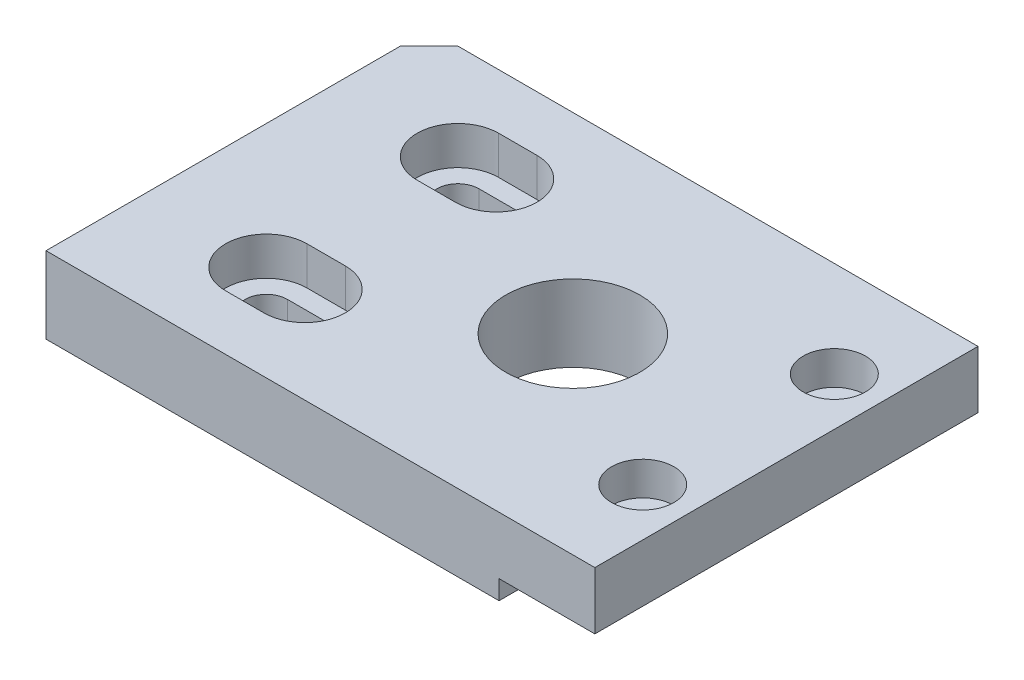
ISO-10303-21;
HEADER;
FILE_DESCRIPTION(('STEP AP214'),'2;1');
FILE_NAME('part.step','',(''),(''),'','','');
FILE_SCHEMA(('AUTOMOTIVE_DESIGN { 1 0 10303 214 1 1 1 1 }'));
ENDSEC;
DATA;
#1=APPLICATION_CONTEXT('core data for automotive mechanical design processes');
#2=APPLICATION_PROTOCOL_DEFINITION('international standard','automotive_design',2000,#1);
#3=PRODUCT_CONTEXT('',#1,'mechanical');
#4=PRODUCT('Part','Part','',(#3));
#5=PRODUCT_RELATED_PRODUCT_CATEGORY('part','',(#4));
#6=PRODUCT_DEFINITION_FORMATION('','',#4);
#7=PRODUCT_DEFINITION_CONTEXT('part definition',#1,'design');
#8=PRODUCT_DEFINITION('design','',#6,#7);
#9=PRODUCT_DEFINITION_SHAPE('','',#8);
#10=(LENGTH_UNIT() NAMED_UNIT(*) SI_UNIT(.MILLI.,.METRE.));
#11=(NAMED_UNIT(*) PLANE_ANGLE_UNIT() SI_UNIT($,.RADIAN.));
#12=(NAMED_UNIT(*) SI_UNIT($,.STERADIAN.) SOLID_ANGLE_UNIT());
#13=UNCERTAINTY_MEASURE_WITH_UNIT(LENGTH_MEASURE(1.E-05),#10,'distance_accuracy_value','');
#14=(GEOMETRIC_REPRESENTATION_CONTEXT(3) GLOBAL_UNCERTAINTY_ASSIGNED_CONTEXT((#13)) GLOBAL_UNIT_ASSIGNED_CONTEXT((#10,
#11,#12)) REPRESENTATION_CONTEXT('',''));
#15=CARTESIAN_POINT('',(0.,0.,0.));
#16=DIRECTION('',(0.,0.,1.));
#17=DIRECTION('',(1.,0.,0.));
#18=AXIS2_PLACEMENT_3D('',#15,#16,#17);
#19=CARTESIAN_POINT('',(17.0000000009921,4.,34.25));
#20=DIRECTION('',(0.,0.,-1.));
#21=DIRECTION('',(0.,-1.,0.));
#22=AXIS2_PLACEMENT_3D('',#19,#20,#21);
#23=PLANE('',#22);
#24=DIRECTION('',(-1.,0.,0.));
#25=VECTOR('',#24,1.);
#26=CARTESIAN_POINT('',(17.0000000009921,8.,34.25));
#27=LINE('',#26,#25);
#28=CARTESIAN_POINT('',(17.0000000010029,8.,34.25));
#29=VERTEX_POINT('',#28);
#30=CARTESIAN_POINT('',(13.0000000009816,8.,34.25));
#31=VERTEX_POINT('',#30);
#32=EDGE_CURVE('E283',#29,#31,#27,.T.);
#33=ORIENTED_EDGE('',*,*,#32,.F.);
#34=DIRECTION('',(0.,-1.,0.));
#35=VECTOR('',#34,1.);
#36=CARTESIAN_POINT('',(17.0000000010029,4.,34.25));
#37=LINE('',#36,#35);
#38=CARTESIAN_POINT('',(17.0000000010029,4.,34.25));
#39=VERTEX_POINT('',#38);
#40=EDGE_CURVE('E11',#29,#39,#37,.T.);
#41=ORIENTED_EDGE('',*,*,#40,.T.);
#42=DIRECTION('',(1.,0.,0.));
#43=VECTOR('',#42,1.);
#44=CARTESIAN_POINT('',(17.0000000009921,4.,34.25));
#45=LINE('',#44,#43);
#46=CARTESIAN_POINT('',(13.0000000009816,4.,34.25));
#47=VERTEX_POINT('',#46);
#48=EDGE_CURVE('E352',#47,#39,#45,.T.);
#49=ORIENTED_EDGE('',*,*,#48,.F.);
#50=DIRECTION('',(0.,-1.,0.));
#51=VECTOR('',#50,1.);
#52=CARTESIAN_POINT('',(13.0000000009816,4.,34.25));
#53=LINE('',#52,#51);
#54=EDGE_CURVE('E366',#31,#47,#53,.T.);
#55=ORIENTED_EDGE('',*,*,#54,.F.);
#56=EDGE_LOOP('',(#33,#41,#49,#55));
#57=FACE_BOUND('',#56,.T.);
#58=ADVANCED_FACE('F16',(#57),#23,.T.);
#59=CARTESIAN_POINT('',(17.0000000009921,4.,30.));
#60=DIRECTION('',(0.,1.,0.));
#61=DIRECTION('',(0.,0.,1.));
#62=AXIS2_PLACEMENT_3D('',#59,#60,#61);
#63=CYLINDRICAL_SURFACE('',#62,4.25);
#64=CARTESIAN_POINT('',(17.0000000009921,8.,30.));
#65=DIRECTION('',(0.,-1.,0.));
#66=DIRECTION('',(-1.,0.,0.));
#67=AXIS2_PLACEMENT_3D('',#64,#65,#66);
#68=CIRCLE('',#67,4.25);
#69=CARTESIAN_POINT('',(17.0000000009921,8.,25.75));
#70=VERTEX_POINT('',#69);
#71=EDGE_CURVE('E416',#70,#29,#68,.T.);
#72=ORIENTED_EDGE('',*,*,#71,.F.);
#73=DIRECTION('',(0.,-1.,0.));
#74=VECTOR('',#73,1.);
#75=CARTESIAN_POINT('',(17.0000000009921,4.,25.75));
#76=LINE('',#75,#74);
#77=CARTESIAN_POINT('',(17.0000000009921,4.,25.75));
#78=VERTEX_POINT('',#77);
#79=EDGE_CURVE('E27',#70,#78,#76,.T.);
#80=ORIENTED_EDGE('',*,*,#79,.T.);
#81=CARTESIAN_POINT('',(17.0000000009921,4.,30.));
#82=DIRECTION('',(0.,1.,0.));
#83=DIRECTION('',(-1.,0.,0.));
#84=AXIS2_PLACEMENT_3D('',#81,#82,#83);
#85=CIRCLE('',#84,4.25);
#86=EDGE_CURVE('E356',#39,#78,#85,.T.);
#87=ORIENTED_EDGE('',*,*,#86,.F.);
#88=ORIENTED_EDGE('',*,*,#40,.F.);
#89=EDGE_LOOP('',(#72,#80,#87,#88));
#90=FACE_BOUND('',#89,.T.);
#91=ADVANCED_FACE('F563',(#90),#63,.F.);
#92=CARTESIAN_POINT('',(13.0000000009924,4.,25.75));
#93=DIRECTION('',(0.,0.,1.));
#94=DIRECTION('',(1.,0.,0.));
#95=AXIS2_PLACEMENT_3D('',#92,#93,#94);
#96=PLANE('',#95);
#97=DIRECTION('',(1.,0.,0.));
#98=VECTOR('',#97,1.);
#99=CARTESIAN_POINT('',(13.0000000009924,8.,25.75));
#100=LINE('',#99,#98);
#101=CARTESIAN_POINT('',(13.0000000009834,8.,25.75));
#102=VERTEX_POINT('',#101);
#103=EDGE_CURVE('E420',#102,#70,#100,.T.);
#104=ORIENTED_EDGE('',*,*,#103,.F.);
#105=DIRECTION('',(0.,-1.,0.));
#106=VECTOR('',#105,1.);
#107=CARTESIAN_POINT('',(13.0000000009834,4.,25.75));
#108=LINE('',#107,#106);
#109=CARTESIAN_POINT('',(13.0000000009834,4.,25.75));
#110=VERTEX_POINT('',#109);
#111=EDGE_CURVE('E371',#102,#110,#108,.T.);
#112=ORIENTED_EDGE('',*,*,#111,.T.);
#113=DIRECTION('',(-1.,0.,0.));
#114=VECTOR('',#113,1.);
#115=CARTESIAN_POINT('',(13.0000000009924,4.,25.75));
#116=LINE('',#115,#114);
#117=EDGE_CURVE('E362',#78,#110,#116,.T.);
#118=ORIENTED_EDGE('',*,*,#117,.F.);
#119=ORIENTED_EDGE('',*,*,#79,.F.);
#120=EDGE_LOOP('',(#104,#112,#118,#119));
#121=FACE_BOUND('',#120,.T.);
#122=ADVANCED_FACE('F553',(#121),#96,.T.);
#123=CARTESIAN_POINT('',(13.0000000009924,4.,30.));
#124=DIRECTION('',(0.,1.,0.));
#125=DIRECTION('',(0.,0.,1.));
#126=AXIS2_PLACEMENT_3D('',#123,#124,#125);
#127=CYLINDRICAL_SURFACE('',#126,4.25);
#128=CARTESIAN_POINT('',(13.0000000009924,8.,30.));
#129=DIRECTION('',(0.,-1.,0.));
#130=DIRECTION('',(-1.,0.,0.));
#131=AXIS2_PLACEMENT_3D('',#128,#129,#130);
#132=CIRCLE('',#131,4.25);
#133=EDGE_CURVE('E287',#31,#102,#132,.T.);
#134=ORIENTED_EDGE('',*,*,#133,.F.);
#135=ORIENTED_EDGE('',*,*,#54,.T.);
#136=CARTESIAN_POINT('',(13.0000000009924,4.,30.));
#137=DIRECTION('',(0.,1.,0.));
#138=DIRECTION('',(-1.,0.,0.));
#139=AXIS2_PLACEMENT_3D('',#136,#137,#138);
#140=CIRCLE('',#139,4.25);
#141=EDGE_CURVE('E253',#110,#47,#140,.T.);
#142=ORIENTED_EDGE('',*,*,#141,.F.);
#143=ORIENTED_EDGE('',*,*,#111,.F.);
#144=EDGE_LOOP('',(#134,#135,#142,#143));
#145=FACE_BOUND('',#144,.T.);
#146=ADVANCED_FACE('F559',(#145),#127,.F.);
#147=CARTESIAN_POINT('',(13.0000000009924,4.,30.));
#148=DIRECTION('',(0.,-1.,0.));
#149=DIRECTION('',(0.,0.,-1.));
#150=AXIS2_PLACEMENT_3D('',#147,#148,#149);
#151=PLANE('',#150);
#152=DIRECTION('',(-1.,0.,5.68928584798764E-11));
#153=VECTOR('',#152,1.);
#154=CARTESIAN_POINT('',(17.000000000867,4.,27.8));
#155=LINE('',#154,#153);
#156=CARTESIAN_POINT('',(17.0000000009921,4.,27.8));
#157=VERTEX_POINT('',#156);
#158=CARTESIAN_POINT('',(13.0000000008672,4.,27.8000000002276));
#159=VERTEX_POINT('',#158);
#160=EDGE_CURVE('E314',#157,#159,#155,.T.);
#161=ORIENTED_EDGE('',*,*,#160,.F.);
#162=CARTESIAN_POINT('',(17.0000000009921,4.,30.));
#163=DIRECTION('',(0.,1.,0.));
#164=DIRECTION('',(0.,0.,-1.));
#165=AXIS2_PLACEMENT_3D('',#162,#163,#164);
#166=CIRCLE('',#165,2.2);
#167=CARTESIAN_POINT('',(17.0000000009296,4.,32.2));
#168=VERTEX_POINT('',#167);
#169=EDGE_CURVE('E370',#168,#157,#166,.T.);
#170=ORIENTED_EDGE('',*,*,#169,.F.);
#171=DIRECTION('',(1.,0.,5.68937258416144E-11));
#172=VECTOR('',#171,1.);
#173=CARTESIAN_POINT('',(13.0000000008672,4.,32.1999999997724));
#174=LINE('',#173,#172);
#175=CARTESIAN_POINT('',(13.0000000009924,4.,32.1999999997724));
#176=VERTEX_POINT('',#175);
#177=EDGE_CURVE('E291',#176,#168,#174,.T.);
#178=ORIENTED_EDGE('',*,*,#177,.F.);
#179=CARTESIAN_POINT('',(13.0000000009924,4.,30.));
#180=DIRECTION('',(0.,1.,0.));
#181=DIRECTION('',(0.,0.,-1.));
#182=AXIS2_PLACEMENT_3D('',#179,#180,#181);
#183=CIRCLE('',#182,2.19999999977243);
#184=EDGE_CURVE('E292',#159,#176,#183,.T.);
#185=ORIENTED_EDGE('',*,*,#184,.F.);
#186=EDGE_LOOP('',(#161,#170,#178,#185));
#187=FACE_BOUND('',#186,.T.);
#188=ORIENTED_EDGE('',*,*,#141,.T.);
#189=ORIENTED_EDGE('',*,*,#48,.T.);
#190=ORIENTED_EDGE('',*,*,#86,.T.);
#191=ORIENTED_EDGE('',*,*,#117,.T.);
#192=EDGE_LOOP('',(#188,#189,#190,#191));
#193=FACE_BOUND('',#192,.T.);
#194=ADVANCED_FACE('F558',(#187,#193),#151,.F.);
#195=CARTESIAN_POINT('',(12.9999999999912,4.,9.99999999989814));
#196=DIRECTION('',(0.,1.,0.));
#197=DIRECTION('',(0.,0.,1.));
#198=AXIS2_PLACEMENT_3D('',#195,#196,#197);
#199=CYLINDRICAL_SURFACE('',#198,4.25);
#200=CARTESIAN_POINT('',(12.9999999999912,8.,9.99999999989814));
#201=DIRECTION('',(0.,-1.,0.));
#202=DIRECTION('',(-1.,0.,0.));
#203=AXIS2_PLACEMENT_3D('',#200,#201,#202);
#204=CIRCLE('',#203,4.25);
#205=CARTESIAN_POINT('',(12.999999999883,8.,14.2499999998981));
#206=VERTEX_POINT('',#205);
#207=CARTESIAN_POINT('',(13.0000000000995,8.,5.74999999989814));
#208=VERTEX_POINT('',#207);
#209=EDGE_CURVE('E248',#206,#208,#204,.T.);
#210=ORIENTED_EDGE('',*,*,#209,.F.);
#211=DIRECTION('',(0.,-1.,0.));
#212=VECTOR('',#211,1.);
#213=CARTESIAN_POINT('',(12.999999999883,4.,14.2499999998981));
#214=LINE('',#213,#212);
#215=CARTESIAN_POINT('',(12.999999999883,4.,14.2499999998981));
#216=VERTEX_POINT('',#215);
#217=EDGE_CURVE('E240',#206,#216,#214,.T.);
#218=ORIENTED_EDGE('',*,*,#217,.T.);
#219=CARTESIAN_POINT('',(12.9999999999912,4.,9.99999999989814));
#220=DIRECTION('',(0.,1.,0.));
#221=DIRECTION('',(-1.,0.,0.));
#222=AXIS2_PLACEMENT_3D('',#219,#220,#221);
#223=CIRCLE('',#222,4.25);
#224=CARTESIAN_POINT('',(13.0000000000995,4.,5.74999999989814));
#225=VERTEX_POINT('',#224);
#226=EDGE_CURVE('E245',#225,#216,#223,.T.);
#227=ORIENTED_EDGE('',*,*,#226,.F.);
#228=DIRECTION('',(0.,-1.,0.));
#229=VECTOR('',#228,1.);
#230=CARTESIAN_POINT('',(13.0000000000995,4.,5.74999999989814));
#231=LINE('',#230,#229);
#232=EDGE_CURVE('E351',#208,#225,#231,.T.);
#233=ORIENTED_EDGE('',*,*,#232,.F.);
#234=EDGE_LOOP('',(#210,#218,#227,#233));
#235=FACE_BOUND('',#234,.T.);
#236=ADVANCED_FACE('F242',(#235),#199,.F.);
#237=CARTESIAN_POINT('',(16.9999999998916,4.,14.25));
#238=DIRECTION('',(2.54657406272847E-11,0.,-1.));
#239=DIRECTION('',(0.,-1.,0.));
#240=AXIS2_PLACEMENT_3D('',#237,#238,#239);
#241=PLANE('',#240);
#242=DIRECTION('',(-1.,0.,-2.54657406272847E-11));
#243=VECTOR('',#242,1.);
#244=CARTESIAN_POINT('',(16.9999999998916,8.,14.25));
#245=LINE('',#244,#243);
#246=CARTESIAN_POINT('',(16.9999999999024,8.,14.25));
#247=VERTEX_POINT('',#246);
#248=EDGE_CURVE('E293',#247,#206,#245,.T.);
#249=ORIENTED_EDGE('',*,*,#248,.F.);
#250=DIRECTION('',(0.,-1.,0.));
#251=VECTOR('',#250,1.);
#252=CARTESIAN_POINT('',(16.9999999999024,4.,14.25));
#253=LINE('',#252,#251);
#254=CARTESIAN_POINT('',(16.9999999999024,4.,14.25));
#255=VERTEX_POINT('',#254);
#256=EDGE_CURVE('E254',#247,#255,#253,.T.);
#257=ORIENTED_EDGE('',*,*,#256,.T.);
#258=DIRECTION('',(1.,0.,2.54657406272847E-11));
#259=VECTOR('',#258,1.);
#260=CARTESIAN_POINT('',(16.9999999998916,4.,14.25));
#261=LINE('',#260,#259);
#262=EDGE_CURVE('E257',#216,#255,#261,.T.);
#263=ORIENTED_EDGE('',*,*,#262,.F.);
#264=ORIENTED_EDGE('',*,*,#217,.F.);
#265=EDGE_LOOP('',(#249,#257,#263,#264));
#266=FACE_BOUND('',#265,.T.);
#267=ADVANCED_FACE('F258',(#266),#241,.T.);
#268=CARTESIAN_POINT('',(17.,4.,10.));
#269=DIRECTION('',(0.,1.,0.));
#270=DIRECTION('',(0.,0.,1.));
#271=AXIS2_PLACEMENT_3D('',#268,#269,#270);
#272=CYLINDRICAL_SURFACE('',#271,4.25);
#273=CARTESIAN_POINT('',(17.,8.,10.));
#274=DIRECTION('',(0.,-1.,0.));
#275=DIRECTION('',(-1.,0.,0.));
#276=AXIS2_PLACEMENT_3D('',#273,#274,#275);
#277=CIRCLE('',#276,4.25);
#278=CARTESIAN_POINT('',(17.0000000001081,8.,5.75));
#279=VERTEX_POINT('',#278);
#280=EDGE_CURVE('E297',#279,#247,#277,.T.);
#281=ORIENTED_EDGE('',*,*,#280,.F.);
#282=DIRECTION('',(0.,-1.,0.));
#283=VECTOR('',#282,1.);
#284=CARTESIAN_POINT('',(17.0000000001081,4.,5.75));
#285=LINE('',#284,#283);
#286=CARTESIAN_POINT('',(17.0000000001081,4.,5.75));
#287=VERTEX_POINT('',#286);
#288=EDGE_CURVE('E282',#279,#287,#285,.T.);
#289=ORIENTED_EDGE('',*,*,#288,.T.);
#290=CARTESIAN_POINT('',(17.,4.,10.));
#291=DIRECTION('',(0.,1.,0.));
#292=DIRECTION('',(-1.,0.,0.));
#293=AXIS2_PLACEMENT_3D('',#290,#291,#292);
#294=CIRCLE('',#293,4.25);
#295=EDGE_CURVE('E263',#255,#287,#294,.T.);
#296=ORIENTED_EDGE('',*,*,#295,.F.);
#297=ORIENTED_EDGE('',*,*,#256,.F.);
#298=EDGE_LOOP('',(#281,#289,#296,#297));
#299=FACE_BOUND('',#298,.T.);
#300=ADVANCED_FACE('F610',(#299),#272,.F.);
#301=CARTESIAN_POINT('',(13.0000000000995,4.,5.74999999989814));
#302=DIRECTION('',(-2.54657406272847E-11,0.,1.));
#303=DIRECTION('',(1.,0.,2.54657406272847E-11));
#304=AXIS2_PLACEMENT_3D('',#301,#302,#303);
#305=PLANE('',#304);
#306=DIRECTION('',(1.,0.,2.54657406272847E-11));
#307=VECTOR('',#306,1.);
#308=CARTESIAN_POINT('',(13.0000000000995,8.,5.74999999989814));
#309=LINE('',#308,#307);
#310=EDGE_CURVE('E486',#208,#279,#309,.T.);
#311=ORIENTED_EDGE('',*,*,#310,.F.);
#312=ORIENTED_EDGE('',*,*,#232,.T.);
#313=DIRECTION('',(-1.,0.,-2.54657406272847E-11));
#314=VECTOR('',#313,1.);
#315=CARTESIAN_POINT('',(13.0000000000995,4.,5.74999999989814));
#316=LINE('',#315,#314);
#317=EDGE_CURVE('E267',#287,#225,#316,.T.);
#318=ORIENTED_EDGE('',*,*,#317,.F.);
#319=ORIENTED_EDGE('',*,*,#288,.F.);
#320=EDGE_LOOP('',(#311,#312,#318,#319));
#321=FACE_BOUND('',#320,.T.);
#322=ADVANCED_FACE('F528',(#321),#305,.T.);
#323=CARTESIAN_POINT('',(17.,4.,10.));
#324=DIRECTION('',(0.,-1.,0.));
#325=DIRECTION('',(0.,0.,-1.));
#326=AXIS2_PLACEMENT_3D('',#323,#324,#325);
#327=PLANE('',#326);
#328=DIRECTION('',(1.,0.,4.07985277502092E-11));
#329=VECTOR('',#328,1.);
#330=CARTESIAN_POINT('',(12.9999999999015,4.,12.1999999998368));
#331=LINE('',#330,#329);
#332=CARTESIAN_POINT('',(12.9999999999912,4.,12.1999999998368));
#333=VERTEX_POINT('',#332);
#334=CARTESIAN_POINT('',(16.9999999999427,4.,12.2));
#335=VERTEX_POINT('',#334);
#336=EDGE_CURVE('E97',#333,#335,#331,.T.);
#337=ORIENTED_EDGE('',*,*,#336,.F.);
#338=CARTESIAN_POINT('',(12.9999999999912,4.,9.99999999989813));
#339=DIRECTION('',(0.,1.,0.));
#340=DIRECTION('',(0.,0.,-1.));
#341=AXIS2_PLACEMENT_3D('',#338,#339,#340);
#342=CIRCLE('',#341,2.2);
#343=CARTESIAN_POINT('',(12.9999999999912,4.,7.79999999989813));
#344=VERTEX_POINT('',#343);
#345=EDGE_CURVE('E107',#344,#333,#342,.T.);
#346=ORIENTED_EDGE('',*,*,#345,.F.);
#347=DIRECTION('',(-1.,0.,-2.54640059033865E-11));
#348=VECTOR('',#347,1.);
#349=CARTESIAN_POINT('',(17.0000000001222,4.,7.8));
#350=LINE('',#349,#348);
#351=CARTESIAN_POINT('',(16.9999999999987,4.,7.8));
#352=VERTEX_POINT('',#351);
#353=EDGE_CURVE('E331',#352,#344,#350,.T.);
#354=ORIENTED_EDGE('',*,*,#353,.F.);
#355=CARTESIAN_POINT('',(17.,4.,10.));
#356=DIRECTION('',(0.,1.,0.));
#357=DIRECTION('',(0.,0.,-1.));
#358=AXIS2_PLACEMENT_3D('',#355,#356,#357);
#359=CIRCLE('',#358,2.2);
#360=EDGE_CURVE('E332',#335,#352,#359,.T.);
#361=ORIENTED_EDGE('',*,*,#360,.F.);
#362=EDGE_LOOP('',(#337,#346,#354,#361));
#363=FACE_BOUND('',#362,.T.);
#364=ORIENTED_EDGE('',*,*,#317,.T.);
#365=ORIENTED_EDGE('',*,*,#226,.T.);
#366=ORIENTED_EDGE('',*,*,#262,.T.);
#367=ORIENTED_EDGE('',*,*,#295,.T.);
#368=EDGE_LOOP('',(#364,#365,#366,#367));
#369=FACE_BOUND('',#368,.T.);
#370=ADVANCED_FACE('F265',(#363,#369),#327,.F.);
#371=CARTESIAN_POINT('',(35.0000000011381,8.,20.0000000012687));
#372=DIRECTION('',(0.,-1.,0.));
#373=DIRECTION('',(0.,0.,-1.));
#374=AXIS2_PLACEMENT_3D('',#371,#372,#373);
#375=CYLINDRICAL_SURFACE('',#374,7.);
#376=CARTESIAN_POINT('',(35.0000000011381,0.,20.0000000012687));
#377=DIRECTION('',(0.,1.,0.));
#378=DIRECTION('',(0.,0.,1.));
#379=AXIS2_PLACEMENT_3D('',#376,#377,#378);
#380=CIRCLE('',#379,7.);
#381=CARTESIAN_POINT('',(35.0000000011381,0.,27.0000000012687));
#382=VERTEX_POINT('',#381);
#383=EDGE_CURVE('E445',#382,#382,#380,.T.);
#384=ORIENTED_EDGE('',*,*,#383,.F.);
#385=EDGE_LOOP('',(#384));
#386=FACE_BOUND('',#385,.T.);
#387=CARTESIAN_POINT('',(35.0000000011381,8.,20.0000000012687));
#388=DIRECTION('',(0.,-1.,0.));
#389=DIRECTION('',(0.,0.,-1.));
#390=AXIS2_PLACEMENT_3D('',#387,#388,#389);
#391=CIRCLE('',#390,7.);
#392=CARTESIAN_POINT('',(35.0000000011381,8.,13.0000000012687));
#393=VERTEX_POINT('',#392);
#394=EDGE_CURVE('E296',#393,#393,#391,.T.);
#395=ORIENTED_EDGE('',*,*,#394,.F.);
#396=EDGE_LOOP('',(#395));
#397=FACE_BOUND('',#396,.T.);
#398=ADVANCED_FACE('F634',(#386,#397),#375,.F.);
#399=CARTESIAN_POINT('',(0.,8.,3.));
#400=DIRECTION('',(0.707106781186548,0.,0.707106781186547));
#401=DIRECTION('',(0.,-1.,0.));
#402=AXIS2_PLACEMENT_3D('',#399,#400,#401);
#403=PLANE('',#402);
#404=DIRECTION('',(-0.707106781186547,0.,0.707106781186548));
#405=VECTOR('',#404,1.);
#406=CARTESIAN_POINT('',(0.,8.,3.));
#407=LINE('',#406,#405);
#408=CARTESIAN_POINT('',(3.,8.,0.));
#409=VERTEX_POINT('',#408);
#410=CARTESIAN_POINT('',(0.,8.,3.));
#411=VERTEX_POINT('',#410);
#412=EDGE_CURVE('E302',#409,#411,#407,.T.);
#413=ORIENTED_EDGE('',*,*,#412,.F.);
#414=DIRECTION('',(0.,1.,0.));
#415=VECTOR('',#414,1.);
#416=CARTESIAN_POINT('',(3.,0.,0.));
#417=LINE('',#416,#415);
#418=CARTESIAN_POINT('',(3.,0.,0.));
#419=VERTEX_POINT('',#418);
#420=EDGE_CURVE('E401',#419,#409,#417,.T.);
#421=ORIENTED_EDGE('',*,*,#420,.F.);
#422=DIRECTION('',(0.707106781186547,0.,-0.707106781186548));
#423=VECTOR('',#422,1.);
#424=CARTESIAN_POINT('',(0.,0.,3.));
#425=LINE('',#424,#423);
#426=CARTESIAN_POINT('',(0.,0.,3.));
#427=VERTEX_POINT('',#426);
#428=EDGE_CURVE('E327',#427,#419,#425,.T.);
#429=ORIENTED_EDGE('',*,*,#428,.F.);
#430=DIRECTION('',(0.,-1.,0.));
#431=VECTOR('',#430,1.);
#432=CARTESIAN_POINT('',(0.,8.,3.));
#433=LINE('',#432,#431);
#434=EDGE_CURVE('E428',#411,#427,#433,.T.);
#435=ORIENTED_EDGE('',*,*,#434,.F.);
#436=EDGE_LOOP('',(#413,#421,#429,#435));
#437=FACE_BOUND('',#436,.T.);
#438=ADVANCED_FACE('F632',(#437),#403,.F.);
#439=CARTESIAN_POINT('',(52.2999999982934,8.,29.9999999997155));
#440=DIRECTION('',(0.,-1.,0.));
#441=DIRECTION('',(0.,0.,-1.));
#442=AXIS2_PLACEMENT_3D('',#439,#440,#441);
#443=CYLINDRICAL_SURFACE('',#442,3.25);
#444=CARTESIAN_POINT('',(52.2999999982934,8.,29.9999999997155));
#445=DIRECTION('',(0.,-1.,0.));
#446=DIRECTION('',(0.,0.,-1.));
#447=AXIS2_PLACEMENT_3D('',#444,#445,#446);
#448=CIRCLE('',#447,3.25);
#449=CARTESIAN_POINT('',(52.2999999982934,8.,26.7499999997155));
#450=VERTEX_POINT('',#449);
#451=EDGE_CURVE('E380',#450,#450,#448,.T.);
#452=ORIENTED_EDGE('',*,*,#451,.F.);
#453=EDGE_LOOP('',(#452));
#454=FACE_BOUND('',#453,.T.);
#455=CARTESIAN_POINT('',(52.2999999982934,4.5,29.9999999997155));
#456=DIRECTION('',(0.,1.,0.));
#457=DIRECTION('',(0.,0.,-1.));
#458=AXIS2_PLACEMENT_3D('',#455,#456,#457);
#459=CIRCLE('',#458,3.25);
#460=CARTESIAN_POINT('',(52.2999999982934,4.5,26.7499999997155));
#461=VERTEX_POINT('',#460);
#462=EDGE_CURVE('E273',#461,#461,#459,.T.);
#463=ORIENTED_EDGE('',*,*,#462,.F.);
#464=EDGE_LOOP('',(#463));
#465=FACE_BOUND('',#464,.T.);
#466=ADVANCED_FACE('F629',(#454,#465),#443,.F.);
#467=CARTESIAN_POINT('',(52.2999999982934,4.5,29.9999999997155));
#468=DIRECTION('',(0.,-1.,0.));
#469=DIRECTION('',(0.,0.,-1.));
#470=AXIS2_PLACEMENT_3D('',#467,#468,#469);
#471=PLANE('',#470);
#472=ORIENTED_EDGE('',*,*,#462,.T.);
#473=EDGE_LOOP('',(#472));
#474=FACE_BOUND('',#473,.T.);
#475=CARTESIAN_POINT('',(52.2999999982934,4.5,29.9999999997155));
#476=DIRECTION('',(0.,1.,0.));
#477=DIRECTION('',(0.,0.,-1.));
#478=AXIS2_PLACEMENT_3D('',#475,#476,#477);
#479=CIRCLE('',#478,1.7);
#480=CARTESIAN_POINT('',(52.2999999982934,4.5,28.2999999997155));
#481=VERTEX_POINT('',#480);
#482=EDGE_CURVE('E336',#481,#481,#479,.T.);
#483=ORIENTED_EDGE('',*,*,#482,.F.);
#484=EDGE_LOOP('',(#483));
#485=FACE_BOUND('',#484,.T.);
#486=ADVANCED_FACE('F574',(#474,#485),#471,.F.);
#487=CARTESIAN_POINT('',(52.2999999982934,-24.9349740813159,29.9999999997155));
#488=DIRECTION('',(0.,-1.,0.));
#489=DIRECTION('',(0.,0.,-1.));
#490=AXIS2_PLACEMENT_3D('',#487,#488,#489);
#491=CYLINDRICAL_SURFACE('',#490,1.7);
#492=CARTESIAN_POINT('',(52.2999999982934,2.,29.9999999997155));
#493=DIRECTION('',(0.,1.,0.));
#494=DIRECTION('',(0.,0.,1.));
#495=AXIS2_PLACEMENT_3D('',#492,#493,#494);
#496=CIRCLE('',#495,1.7);
#497=CARTESIAN_POINT('',(52.2999999982934,2.,31.6999999997155));
#498=VERTEX_POINT('',#497);
#499=EDGE_CURVE('E304',#498,#498,#496,.T.);
#500=ORIENTED_EDGE('',*,*,#499,.F.);
#501=EDGE_LOOP('',(#500));
#502=FACE_BOUND('',#501,.T.);
#503=ORIENTED_EDGE('',*,*,#482,.T.);
#504=EDGE_LOOP('',(#503));
#505=FACE_BOUND('',#504,.T.);
#506=ADVANCED_FACE('F597',(#502,#505),#491,.F.);
#507=CARTESIAN_POINT('',(52.2999999994313,8.,9.99999999971553));
#508=DIRECTION('',(0.,-1.,0.));
#509=DIRECTION('',(0.,0.,-1.));
#510=AXIS2_PLACEMENT_3D('',#507,#508,#509);
#511=CYLINDRICAL_SURFACE('',#510,3.25);
#512=CARTESIAN_POINT('',(52.2999999994313,8.,9.99999999971553));
#513=DIRECTION('',(0.,-1.,0.));
#514=DIRECTION('',(0.,0.,-1.));
#515=AXIS2_PLACEMENT_3D('',#512,#513,#514);
#516=CIRCLE('',#515,3.25);
#517=CARTESIAN_POINT('',(52.2999999994313,8.,6.74999999971553));
#518=VERTEX_POINT('',#517);
#519=EDGE_CURVE('E303',#518,#518,#516,.T.);
#520=ORIENTED_EDGE('',*,*,#519,.F.);
#521=EDGE_LOOP('',(#520));
#522=FACE_BOUND('',#521,.T.);
#523=CARTESIAN_POINT('',(52.2999999994313,4.5,9.99999999971553));
#524=DIRECTION('',(0.,1.,0.));
#525=DIRECTION('',(0.,0.,-1.));
#526=AXIS2_PLACEMENT_3D('',#523,#524,#525);
#527=CIRCLE('',#526,3.25);
#528=CARTESIAN_POINT('',(52.2999999994313,4.5,6.74999999971553));
#529=VERTEX_POINT('',#528);
#530=EDGE_CURVE('E333',#529,#529,#527,.T.);
#531=ORIENTED_EDGE('',*,*,#530,.F.);
#532=EDGE_LOOP('',(#531));
#533=FACE_BOUND('',#532,.T.);
#534=ADVANCED_FACE('F600',(#522,#533),#511,.F.);
#535=CARTESIAN_POINT('',(52.2999999994313,4.5,9.99999999971553));
#536=DIRECTION('',(0.,-1.,0.));
#537=DIRECTION('',(0.,0.,-1.));
#538=AXIS2_PLACEMENT_3D('',#535,#536,#537);
#539=PLANE('',#538);
#540=ORIENTED_EDGE('',*,*,#530,.T.);
#541=EDGE_LOOP('',(#540));
#542=FACE_BOUND('',#541,.T.);
#543=CARTESIAN_POINT('',(52.2999999994313,4.5,9.99999999971553));
#544=DIRECTION('',(0.,1.,0.));
#545=DIRECTION('',(0.,0.,-1.));
#546=AXIS2_PLACEMENT_3D('',#543,#544,#545);
#547=CIRCLE('',#546,1.7);
#548=CARTESIAN_POINT('',(52.2999999994313,4.5,8.29999999971553));
#549=VERTEX_POINT('',#548);
#550=EDGE_CURVE('E337',#549,#549,#547,.T.);
#551=ORIENTED_EDGE('',*,*,#550,.F.);
#552=EDGE_LOOP('',(#551));
#553=FACE_BOUND('',#552,.T.);
#554=ADVANCED_FACE('F620',(#542,#553),#539,.F.);
#555=CARTESIAN_POINT('',(52.2999999994313,-24.9349740801892,9.99999999971553));
#556=DIRECTION('',(0.,-1.,0.));
#557=DIRECTION('',(0.,0.,-1.));
#558=AXIS2_PLACEMENT_3D('',#555,#556,#557);
#559=CYLINDRICAL_SURFACE('',#558,1.7);
#560=CARTESIAN_POINT('',(52.2999999994313,2.,9.99999999971553));
#561=DIRECTION('',(0.,1.,0.));
#562=DIRECTION('',(0.,0.,1.));
#563=AXIS2_PLACEMENT_3D('',#560,#561,#562);
#564=CIRCLE('',#563,1.7);
#565=CARTESIAN_POINT('',(52.2999999994313,2.,11.6999999997155));
#566=VERTEX_POINT('',#565);
#567=EDGE_CURVE('E206',#566,#566,#564,.T.);
#568=ORIENTED_EDGE('',*,*,#567,.F.);
#569=EDGE_LOOP('',(#568));
#570=FACE_BOUND('',#569,.T.);
#571=ORIENTED_EDGE('',*,*,#550,.T.);
#572=EDGE_LOOP('',(#571));
#573=FACE_BOUND('',#572,.T.);
#574=ADVANCED_FACE('F18',(#570,#573),#559,.F.);
#575=CARTESIAN_POINT('',(12.9999999999015,0.,12.1999999998368));
#576=DIRECTION('',(-4.07985277502092E-11,0.,1.));
#577=DIRECTION('',(1.,0.,4.07985277502092E-11));
#578=AXIS2_PLACEMENT_3D('',#575,#576,#577);
#579=PLANE('',#578);
#580=DIRECTION('',(0.,-1.,0.));
#581=VECTOR('',#580,1.);
#582=CARTESIAN_POINT('',(12.9999999999912,0.,12.1999999998981));
#583=LINE('',#582,#581);
#584=CARTESIAN_POINT('',(12.9999999999912,0.,12.1999999998981));
#585=VERTEX_POINT('',#584);
#586=EDGE_CURVE('E311',#333,#585,#583,.T.);
#587=ORIENTED_EDGE('',*,*,#586,.F.);
#588=ORIENTED_EDGE('',*,*,#336,.T.);
#589=DIRECTION('',(0.,-1.,0.));
#590=VECTOR('',#589,1.);
#591=CARTESIAN_POINT('',(16.9999999999427,0.,12.2));
#592=LINE('',#591,#590);
#593=CARTESIAN_POINT('',(16.9999999999427,0.,12.2));
#594=VERTEX_POINT('',#593);
#595=EDGE_CURVE('E318',#335,#594,#592,.T.);
#596=ORIENTED_EDGE('',*,*,#595,.T.);
#597=DIRECTION('',(1.,0.,4.07985277502092E-11));
#598=VECTOR('',#597,1.);
#599=CARTESIAN_POINT('',(12.9999999999015,0.,12.1999999998368));
#600=LINE('',#599,#598);
#601=EDGE_CURVE('E435',#585,#594,#600,.T.);
#602=ORIENTED_EDGE('',*,*,#601,.F.);
#603=EDGE_LOOP('',(#587,#588,#596,#602));
#604=FACE_BOUND('',#603,.T.);
#605=ADVANCED_FACE('F608',(#604),#579,.F.);
#606=CARTESIAN_POINT('',(12.9999999999912,0.,9.99999999989813));
#607=DIRECTION('',(0.,1.,0.));
#608=DIRECTION('',(0.,0.,1.));
#609=AXIS2_PLACEMENT_3D('',#606,#607,#608);
#610=CYLINDRICAL_SURFACE('',#609,2.2);
#611=DIRECTION('',(0.,-1.,0.));
#612=VECTOR('',#611,1.);
#613=CARTESIAN_POINT('',(13.0000000000473,0.,7.79999999989813));
#614=LINE('',#613,#612);
#615=CARTESIAN_POINT('',(13.0000000000473,0.,7.79999999989813));
#616=VERTEX_POINT('',#615);
#617=EDGE_CURVE('E395',#344,#616,#614,.T.);
#618=ORIENTED_EDGE('',*,*,#617,.F.);
#619=ORIENTED_EDGE('',*,*,#345,.T.);
#620=ORIENTED_EDGE('',*,*,#586,.T.);
#621=CARTESIAN_POINT('',(12.9999999999912,0.,9.99999999989813));
#622=DIRECTION('',(0.,1.,0.));
#623=DIRECTION('',(1.,0.,0.));
#624=AXIS2_PLACEMENT_3D('',#621,#622,#623);
#625=CIRCLE('',#624,2.2);
#626=EDGE_CURVE('E410',#616,#585,#625,.T.);
#627=ORIENTED_EDGE('',*,*,#626,.F.);
#628=EDGE_LOOP('',(#618,#619,#620,#627));
#629=FACE_BOUND('',#628,.T.);
#630=ADVANCED_FACE('F604',(#629),#610,.F.);
#631=CARTESIAN_POINT('',(17.0000000001222,0.,7.8));
#632=DIRECTION('',(2.54640059033865E-11,0.,-1.));
#633=DIRECTION('',(0.,-1.,0.));
#634=AXIS2_PLACEMENT_3D('',#631,#632,#633);
#635=PLANE('',#634);
#636=DIRECTION('',(0.,-1.,0.));
#637=VECTOR('',#636,1.);
#638=CARTESIAN_POINT('',(16.9999999999987,0.,7.8));
#639=LINE('',#638,#637);
#640=CARTESIAN_POINT('',(16.9999999999987,0.,7.8));
#641=VERTEX_POINT('',#640);
#642=EDGE_CURVE('E328',#352,#641,#639,.T.);
#643=ORIENTED_EDGE('',*,*,#642,.F.);
#644=ORIENTED_EDGE('',*,*,#353,.T.);
#645=ORIENTED_EDGE('',*,*,#617,.T.);
#646=DIRECTION('',(-1.,0.,-2.54640059033865E-11));
#647=VECTOR('',#646,1.);
#648=CARTESIAN_POINT('',(17.0000000001222,0.,7.8));
#649=LINE('',#648,#647);
#650=EDGE_CURVE('E434',#641,#616,#649,.T.);
#651=ORIENTED_EDGE('',*,*,#650,.F.);
#652=EDGE_LOOP('',(#643,#644,#645,#651));
#653=FACE_BOUND('',#652,.T.);
#654=ADVANCED_FACE('F586',(#653),#635,.F.);
#655=CARTESIAN_POINT('',(17.,0.,10.));
#656=DIRECTION('',(0.,1.,0.));
#657=DIRECTION('',(0.,0.,1.));
#658=AXIS2_PLACEMENT_3D('',#655,#656,#657);
#659=CYLINDRICAL_SURFACE('',#658,2.2);
#660=ORIENTED_EDGE('',*,*,#595,.F.);
#661=ORIENTED_EDGE('',*,*,#360,.T.);
#662=ORIENTED_EDGE('',*,*,#642,.T.);
#663=CARTESIAN_POINT('',(17.,0.,10.));
#664=DIRECTION('',(0.,1.,0.));
#665=DIRECTION('',(1.,0.,0.));
#666=AXIS2_PLACEMENT_3D('',#663,#664,#665);
#667=CIRCLE('',#666,2.2);
#668=EDGE_CURVE('E430',#594,#641,#667,.T.);
#669=ORIENTED_EDGE('',*,*,#668,.F.);
#670=EDGE_LOOP('',(#660,#661,#662,#669));
#671=FACE_BOUND('',#670,.T.);
#672=ADVANCED_FACE('F582',(#671),#659,.F.);
#673=CARTESIAN_POINT('',(17.000000000867,0.,27.8));
#674=DIRECTION('',(-5.68928584798764E-11,0.,-1.));
#675=DIRECTION('',(-1.,0.,5.68928584798764E-11));
#676=AXIS2_PLACEMENT_3D('',#673,#674,#675);
#677=PLANE('',#676);
#678=DIRECTION('',(0.,-1.,0.));
#679=VECTOR('',#678,1.);
#680=CARTESIAN_POINT('',(17.0000000009921,0.,27.8));
#681=LINE('',#680,#679);
#682=CARTESIAN_POINT('',(17.0000000009921,0.,27.8));
#683=VERTEX_POINT('',#682);
#684=EDGE_CURVE('E319',#157,#683,#681,.T.);
#685=ORIENTED_EDGE('',*,*,#684,.F.);
#686=ORIENTED_EDGE('',*,*,#160,.T.);
#687=DIRECTION('',(0.,-1.,0.));
#688=VECTOR('',#687,1.);
#689=CARTESIAN_POINT('',(13.0000000008672,0.,27.8000000002276));
#690=LINE('',#689,#688);
#691=CARTESIAN_POINT('',(13.0000000008672,0.,27.8000000002276));
#692=VERTEX_POINT('',#691);
#693=EDGE_CURVE('E310',#159,#692,#690,.T.);
#694=ORIENTED_EDGE('',*,*,#693,.T.);
#695=DIRECTION('',(-1.,0.,5.68928584798764E-11));
#696=VECTOR('',#695,1.);
#697=CARTESIAN_POINT('',(17.000000000867,0.,27.8));
#698=LINE('',#697,#696);
#699=EDGE_CURVE('E405',#683,#692,#698,.T.);
#700=ORIENTED_EDGE('',*,*,#699,.F.);
#701=EDGE_LOOP('',(#685,#686,#694,#700));
#702=FACE_BOUND('',#701,.T.);
#703=ADVANCED_FACE('F585',(#702),#677,.F.);
#704=CARTESIAN_POINT('',(17.0000000009921,0.,30.));
#705=DIRECTION('',(0.,1.,0.));
#706=DIRECTION('',(0.,0.,1.));
#707=AXIS2_PLACEMENT_3D('',#704,#705,#706);
#708=CYLINDRICAL_SURFACE('',#707,2.2);
#709=DIRECTION('',(0.,-1.,0.));
#710=VECTOR('',#709,1.);
#711=CARTESIAN_POINT('',(17.000000000867,0.,32.2));
#712=LINE('',#711,#710);
#713=CARTESIAN_POINT('',(17.0000000009921,0.,32.2));
#714=VERTEX_POINT('',#713);
#715=EDGE_CURVE('E375',#168,#714,#712,.T.);
#716=ORIENTED_EDGE('',*,*,#715,.F.);
#717=ORIENTED_EDGE('',*,*,#169,.T.);
#718=ORIENTED_EDGE('',*,*,#684,.T.);
#719=CARTESIAN_POINT('',(17.0000000009921,0.,30.));
#720=DIRECTION('',(0.,1.,0.));
#721=DIRECTION('',(1.,0.,0.));
#722=AXIS2_PLACEMENT_3D('',#719,#720,#721);
#723=CIRCLE('',#722,2.2);
#724=EDGE_CURVE('E344',#714,#683,#723,.T.);
#725=ORIENTED_EDGE('',*,*,#724,.F.);
#726=EDGE_LOOP('',(#716,#717,#718,#725));
#727=FACE_BOUND('',#726,.T.);
#728=ADVANCED_FACE('F627',(#727),#708,.F.);
#729=CARTESIAN_POINT('',(13.0000000008672,0.,32.1999999997724));
#730=DIRECTION('',(-5.68937258416144E-11,0.,1.));
#731=DIRECTION('',(1.,0.,5.68937258416144E-11));
#732=AXIS2_PLACEMENT_3D('',#729,#730,#731);
#733=PLANE('',#732);
#734=DIRECTION('',(0.,-1.,0.));
#735=VECTOR('',#734,1.);
#736=CARTESIAN_POINT('',(13.0000000009924,0.,32.1999999997724));
#737=LINE('',#736,#735);
#738=CARTESIAN_POINT('',(13.0000000009924,0.,32.1999999997724));
#739=VERTEX_POINT('',#738);
#740=EDGE_CURVE('E288',#176,#739,#737,.T.);
#741=ORIENTED_EDGE('',*,*,#740,.F.);
#742=ORIENTED_EDGE('',*,*,#177,.T.);
#743=ORIENTED_EDGE('',*,*,#715,.T.);
#744=DIRECTION('',(1.,0.,5.68937258416144E-11));
#745=VECTOR('',#744,1.);
#746=CARTESIAN_POINT('',(13.0000000008672,0.,32.1999999997724));
#747=LINE('',#746,#745);
#748=EDGE_CURVE('E391',#739,#714,#747,.T.);
#749=ORIENTED_EDGE('',*,*,#748,.F.);
#750=EDGE_LOOP('',(#741,#742,#743,#749));
#751=FACE_BOUND('',#750,.T.);
#752=ADVANCED_FACE('F624',(#751),#733,.F.);
#753=CARTESIAN_POINT('',(13.0000000009924,0.,30.));
#754=DIRECTION('',(0.,1.,0.));
#755=DIRECTION('',(0.,0.,1.));
#756=AXIS2_PLACEMENT_3D('',#753,#754,#755);
#757=CYLINDRICAL_SURFACE('',#756,2.19999999977243);
#758=ORIENTED_EDGE('',*,*,#693,.F.);
#759=ORIENTED_EDGE('',*,*,#184,.T.);
#760=ORIENTED_EDGE('',*,*,#740,.T.);
#761=CARTESIAN_POINT('',(13.0000000009924,0.,30.));
#762=DIRECTION('',(0.,1.,0.));
#763=DIRECTION('',(1.,0.,0.));
#764=AXIS2_PLACEMENT_3D('',#761,#762,#763);
#765=CIRCLE('',#764,2.19999999977243);
#766=EDGE_CURVE('E409',#692,#739,#765,.T.);
#767=ORIENTED_EDGE('',*,*,#766,.F.);
#768=EDGE_LOOP('',(#758,#759,#760,#767));
#769=FACE_BOUND('',#768,.T.);
#770=ADVANCED_FACE('F596',(#769),#757,.F.);
#771=CARTESIAN_POINT('',(0.,0.,0.));
#772=DIRECTION('',(0.,0.,1.));
#773=DIRECTION('',(1.,0.,0.));
#774=AXIS2_PLACEMENT_3D('',#771,#772,#773);
#775=PLANE('',#774);
#776=DIRECTION('',(1.,0.,0.));
#777=VECTOR('',#776,1.);
#778=CARTESIAN_POINT('',(0.,0.,0.));
#779=LINE('',#778,#777);
#780=CARTESIAN_POINT('',(47.3,0.,0.));
#781=VERTEX_POINT('',#780);
#782=EDGE_CURVE('E279',#419,#781,#779,.T.);
#783=ORIENTED_EDGE('',*,*,#782,.F.);
#784=ORIENTED_EDGE('',*,*,#420,.T.);
#785=DIRECTION('',(-1.,0.,0.));
#786=VECTOR('',#785,1.);
#787=CARTESIAN_POINT('',(57.3,8.,0.));
#788=LINE('',#787,#786);
#789=CARTESIAN_POINT('',(57.3,8.,0.));
#790=VERTEX_POINT('',#789);
#791=EDGE_CURVE('E298',#790,#409,#788,.T.);
#792=ORIENTED_EDGE('',*,*,#791,.F.);
#793=DIRECTION('',(0.,1.,0.));
#794=VECTOR('',#793,1.);
#795=CARTESIAN_POINT('',(57.3,2.,0.));
#796=LINE('',#795,#794);
#797=CARTESIAN_POINT('',(57.3,2.,0.));
#798=VERTEX_POINT('',#797);
#799=EDGE_CURVE('E193',#798,#790,#796,.T.);
#800=ORIENTED_EDGE('',*,*,#799,.F.);
#801=DIRECTION('',(1.,0.,0.));
#802=VECTOR('',#801,1.);
#803=CARTESIAN_POINT('',(47.3,2.,0.));
#804=LINE('',#803,#802);
#805=CARTESIAN_POINT('',(47.3,2.,0.));
#806=VERTEX_POINT('',#805);
#807=EDGE_CURVE('E384',#806,#798,#804,.T.);
#808=ORIENTED_EDGE('',*,*,#807,.F.);
#809=DIRECTION('',(0.,1.,0.));
#810=VECTOR('',#809,1.);
#811=CARTESIAN_POINT('',(47.3,0.,0.));
#812=LINE('',#811,#810);
#813=EDGE_CURVE('E229',#781,#806,#812,.T.);
#814=ORIENTED_EDGE('',*,*,#813,.F.);
#815=EDGE_LOOP('',(#783,#784,#792,#800,#808,#814));
#816=FACE_BOUND('',#815,.T.);
#817=ADVANCED_FACE('F592',(#816),#775,.F.);
#818=CARTESIAN_POINT('',(0.,0.,40.));
#819=DIRECTION('',(0.,0.,1.));
#820=DIRECTION('',(1.,0.,0.));
#821=AXIS2_PLACEMENT_3D('',#818,#819,#820);
#822=PLANE('',#821);
#823=DIRECTION('',(0.,-1.,0.));
#824=VECTOR('',#823,1.);
#825=CARTESIAN_POINT('',(0.,8.,40.));
#826=LINE('',#825,#824);
#827=CARTESIAN_POINT('',(0.,8.,40.));
#828=VERTEX_POINT('',#827);
#829=CARTESIAN_POINT('',(0.,0.,40.));
#830=VERTEX_POINT('',#829);
#831=EDGE_CURVE('E441',#828,#830,#826,.T.);
#832=ORIENTED_EDGE('',*,*,#831,.T.);
#833=DIRECTION('',(1.,0.,0.));
#834=VECTOR('',#833,1.);
#835=CARTESIAN_POINT('',(0.,0.,40.));
#836=LINE('',#835,#834);
#837=CARTESIAN_POINT('',(47.3,0.,40.));
#838=VERTEX_POINT('',#837);
#839=EDGE_CURVE('E278',#830,#838,#836,.T.);
#840=ORIENTED_EDGE('',*,*,#839,.T.);
#841=DIRECTION('',(0.,1.,0.));
#842=VECTOR('',#841,1.);
#843=CARTESIAN_POINT('',(47.3,0.,40.));
#844=LINE('',#843,#842);
#845=CARTESIAN_POINT('',(47.3,2.,40.));
#846=VERTEX_POINT('',#845);
#847=EDGE_CURVE('E219',#838,#846,#844,.T.);
#848=ORIENTED_EDGE('',*,*,#847,.T.);
#849=DIRECTION('',(1.,0.,0.));
#850=VECTOR('',#849,1.);
#851=CARTESIAN_POINT('',(47.3,2.,40.));
#852=LINE('',#851,#850);
#853=CARTESIAN_POINT('',(57.3,2.,40.));
#854=VERTEX_POINT('',#853);
#855=EDGE_CURVE('E323',#846,#854,#852,.T.);
#856=ORIENTED_EDGE('',*,*,#855,.T.);
#857=DIRECTION('',(0.,1.,0.));
#858=VECTOR('',#857,1.);
#859=CARTESIAN_POINT('',(57.3,2.,40.));
#860=LINE('',#859,#858);
#861=CARTESIAN_POINT('',(57.3,8.,40.));
#862=VERTEX_POINT('',#861);
#863=EDGE_CURVE('E322',#854,#862,#860,.T.);
#864=ORIENTED_EDGE('',*,*,#863,.T.);
#865=DIRECTION('',(-1.,0.,0.));
#866=VECTOR('',#865,1.);
#867=CARTESIAN_POINT('',(57.3,8.,40.));
#868=LINE('',#867,#866);
#869=EDGE_CURVE('E429',#862,#828,#868,.T.);
#870=ORIENTED_EDGE('',*,*,#869,.T.);
#871=EDGE_LOOP('',(#832,#840,#848,#856,#864,#870));
#872=FACE_BOUND('',#871,.T.);
#873=ADVANCED_FACE('F588',(#872),#822,.T.);
#874=CARTESIAN_POINT('',(57.3,2.,40.));
#875=DIRECTION('',(-1.,0.,0.));
#876=DIRECTION('',(0.,0.,1.));
#877=AXIS2_PLACEMENT_3D('',#874,#875,#876);
#878=PLANE('',#877);
#879=ORIENTED_EDGE('',*,*,#799,.T.);
#880=DIRECTION('',(0.,0.,-1.));
#881=VECTOR('',#880,1.);
#882=CARTESIAN_POINT('',(57.3,8.,40.));
#883=LINE('',#882,#881);
#884=EDGE_CURVE('E424',#862,#790,#883,.T.);
#885=ORIENTED_EDGE('',*,*,#884,.F.);
#886=ORIENTED_EDGE('',*,*,#863,.F.);
#887=DIRECTION('',(0.,0.,-1.));
#888=VECTOR('',#887,1.);
#889=CARTESIAN_POINT('',(57.3,2.,40.));
#890=LINE('',#889,#888);
#891=EDGE_CURVE('E348',#854,#798,#890,.T.);
#892=ORIENTED_EDGE('',*,*,#891,.T.);
#893=EDGE_LOOP('',(#879,#885,#886,#892));
#894=FACE_BOUND('',#893,.T.);
#895=ADVANCED_FACE('F591',(#894),#878,.F.);
#896=CARTESIAN_POINT('',(47.3,2.,40.));
#897=DIRECTION('',(0.,1.,0.));
#898=DIRECTION('',(1.,0.,0.));
#899=AXIS2_PLACEMENT_3D('',#896,#897,#898);
#900=PLANE('',#899);
#901=ORIENTED_EDGE('',*,*,#807,.T.);
#902=ORIENTED_EDGE('',*,*,#891,.F.);
#903=ORIENTED_EDGE('',*,*,#855,.F.);
#904=DIRECTION('',(0.,0.,-1.));
#905=VECTOR('',#904,1.);
#906=CARTESIAN_POINT('',(47.3,2.,40.));
#907=LINE('',#906,#905);
#908=EDGE_CURVE('E396',#846,#806,#907,.T.);
#909=ORIENTED_EDGE('',*,*,#908,.T.);
#910=EDGE_LOOP('',(#901,#902,#903,#909));
#911=FACE_BOUND('',#910,.T.);
#912=ORIENTED_EDGE('',*,*,#567,.T.);
#913=EDGE_LOOP('',(#912));
#914=FACE_BOUND('',#913,.T.);
#915=ORIENTED_EDGE('',*,*,#499,.T.);
#916=EDGE_LOOP('',(#915));
#917=FACE_BOUND('',#916,.T.);
#918=ADVANCED_FACE('F655',(#911,#914,#917),#900,.F.);
#919=CARTESIAN_POINT('',(47.3,0.,40.));
#920=DIRECTION('',(-1.,0.,0.));
#921=DIRECTION('',(0.,0.,1.));
#922=AXIS2_PLACEMENT_3D('',#919,#920,#921);
#923=PLANE('',#922);
#924=ORIENTED_EDGE('',*,*,#813,.T.);
#925=ORIENTED_EDGE('',*,*,#908,.F.);
#926=ORIENTED_EDGE('',*,*,#847,.F.);
#927=DIRECTION('',(0.,0.,-1.));
#928=VECTOR('',#927,1.);
#929=CARTESIAN_POINT('',(47.3,0.,40.));
#930=LINE('',#929,#928);
#931=EDGE_CURVE('E276',#838,#781,#930,.T.);
#932=ORIENTED_EDGE('',*,*,#931,.T.);
#933=EDGE_LOOP('',(#924,#925,#926,#932));
#934=FACE_BOUND('',#933,.T.);
#935=ADVANCED_FACE('F640',(#934),#923,.F.);
#936=CARTESIAN_POINT('',(0.,0.,40.));
#937=DIRECTION('',(0.,1.,0.));
#938=DIRECTION('',(1.,0.,0.));
#939=AXIS2_PLACEMENT_3D('',#936,#937,#938);
#940=PLANE('',#939);
#941=DIRECTION('',(0.,0.,-1.));
#942=VECTOR('',#941,1.);
#943=CARTESIAN_POINT('',(0.,0.,40.));
#944=LINE('',#943,#942);
#945=EDGE_CURVE('E446',#830,#427,#944,.T.);
#946=ORIENTED_EDGE('',*,*,#945,.T.);
#947=ORIENTED_EDGE('',*,*,#428,.T.);
#948=ORIENTED_EDGE('',*,*,#782,.T.);
#949=ORIENTED_EDGE('',*,*,#931,.F.);
#950=ORIENTED_EDGE('',*,*,#839,.F.);
#951=EDGE_LOOP('',(#946,#947,#948,#949,#950));
#952=FACE_BOUND('',#951,.T.);
#953=ORIENTED_EDGE('',*,*,#699,.T.);
#954=ORIENTED_EDGE('',*,*,#766,.T.);
#955=ORIENTED_EDGE('',*,*,#748,.T.);
#956=ORIENTED_EDGE('',*,*,#724,.T.);
#957=EDGE_LOOP('',(#953,#954,#955,#956));
#958=FACE_BOUND('',#957,.T.);
#959=ORIENTED_EDGE('',*,*,#601,.T.);
#960=ORIENTED_EDGE('',*,*,#668,.T.);
#961=ORIENTED_EDGE('',*,*,#650,.T.);
#962=ORIENTED_EDGE('',*,*,#626,.T.);
#963=EDGE_LOOP('',(#959,#960,#961,#962));
#964=FACE_BOUND('',#963,.T.);
#965=ORIENTED_EDGE('',*,*,#383,.T.);
#966=EDGE_LOOP('',(#965));
#967=FACE_BOUND('',#966,.T.);
#968=ADVANCED_FACE('F580',(#952,#958,#964,#967),#940,.F.);
#969=CARTESIAN_POINT('',(0.,8.,40.));
#970=DIRECTION('',(1.,0.,0.));
#971=DIRECTION('',(0.,-1.,0.));
#972=AXIS2_PLACEMENT_3D('',#969,#970,#971);
#973=PLANE('',#972);
#974=DIRECTION('',(0.,0.,-1.));
#975=VECTOR('',#974,1.);
#976=CARTESIAN_POINT('',(0.,8.,40.));
#977=LINE('',#976,#975);
#978=EDGE_CURVE('E20',#828,#411,#977,.T.);
#979=ORIENTED_EDGE('',*,*,#978,.T.);
#980=ORIENTED_EDGE('',*,*,#434,.T.);
#981=ORIENTED_EDGE('',*,*,#945,.F.);
#982=ORIENTED_EDGE('',*,*,#831,.F.);
#983=EDGE_LOOP('',(#979,#980,#981,#982));
#984=FACE_BOUND('',#983,.T.);
#985=ADVANCED_FACE('F576',(#984),#973,.F.);
#986=CARTESIAN_POINT('',(57.3,8.,40.));
#987=DIRECTION('',(0.,-1.,0.));
#988=DIRECTION('',(0.,0.,-1.));
#989=AXIS2_PLACEMENT_3D('',#986,#987,#988);
#990=PLANE('',#989);
#991=ORIENTED_EDGE('',*,*,#791,.T.);
#992=ORIENTED_EDGE('',*,*,#412,.T.);
#993=ORIENTED_EDGE('',*,*,#978,.F.);
#994=ORIENTED_EDGE('',*,*,#869,.F.);
#995=ORIENTED_EDGE('',*,*,#884,.T.);
#996=EDGE_LOOP('',(#991,#992,#993,#994,#995));
#997=FACE_BOUND('',#996,.T.);
#998=ORIENTED_EDGE('',*,*,#519,.T.);
#999=EDGE_LOOP('',(#998));
#1000=FACE_BOUND('',#999,.T.);
#1001=ORIENTED_EDGE('',*,*,#451,.T.);
#1002=EDGE_LOOP('',(#1001));
#1003=FACE_BOUND('',#1002,.T.);
#1004=ORIENTED_EDGE('',*,*,#394,.T.);
#1005=EDGE_LOOP('',(#1004));
#1006=FACE_BOUND('',#1005,.T.);
#1007=ORIENTED_EDGE('',*,*,#209,.T.);
#1008=ORIENTED_EDGE('',*,*,#310,.T.);
#1009=ORIENTED_EDGE('',*,*,#280,.T.);
#1010=ORIENTED_EDGE('',*,*,#248,.T.);
#1011=EDGE_LOOP('',(#1007,#1008,#1009,#1010));
#1012=FACE_BOUND('',#1011,.T.);
#1013=ORIENTED_EDGE('',*,*,#32,.T.);
#1014=ORIENTED_EDGE('',*,*,#133,.T.);
#1015=ORIENTED_EDGE('',*,*,#103,.T.);
#1016=ORIENTED_EDGE('',*,*,#71,.T.);
#1017=EDGE_LOOP('',(#1013,#1014,#1015,#1016));
#1018=FACE_BOUND('',#1017,.T.);
#1019=ADVANCED_FACE('F579',(#997,#1000,#1003,#1006,#1012,#1018),#990,.F.);
#1020=CLOSED_SHELL('',(#58,#91,#122,#146,#194,#236,#267,#300,#322,#370,#398,#438,#466,#486,#506,
#534,#554,#574,#605,#630,#654,#672,#703,#728,#752,#770,#817,#873,#895,#918,#935,#968,#985,#1019));
#1021=MANIFOLD_SOLID_BREP('B1',#1020);
#1022=ADVANCED_BREP_SHAPE_REPRESENTATION('',(#18,#1021),#14);
#1023=SHAPE_DEFINITION_REPRESENTATION(#9,#1022);
ENDSEC;
END-ISO-10303-21;
